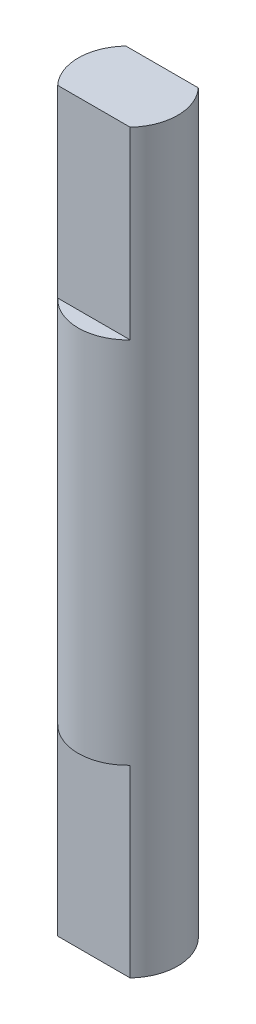
ISO-10303-21;
HEADER;
FILE_DESCRIPTION(('STEP AP214'),'2;1');
FILE_NAME('part.step','',(''),(''),'','','');
FILE_SCHEMA(('AUTOMOTIVE_DESIGN { 1 0 10303 214 1 1 1 1 }'));
ENDSEC;
DATA;
#1=APPLICATION_CONTEXT('core data for automotive mechanical design processes');
#2=APPLICATION_PROTOCOL_DEFINITION('international standard','automotive_design',2000,#1);
#3=PRODUCT_CONTEXT('',#1,'mechanical');
#4=PRODUCT('Part','Part','',(#3));
#5=PRODUCT_RELATED_PRODUCT_CATEGORY('part','',(#4));
#6=PRODUCT_DEFINITION_FORMATION('','',#4);
#7=PRODUCT_DEFINITION_CONTEXT('part definition',#1,'design');
#8=PRODUCT_DEFINITION('design','',#6,#7);
#9=PRODUCT_DEFINITION_SHAPE('','',#8);
#10=(LENGTH_UNIT() NAMED_UNIT(*) SI_UNIT(.MILLI.,.METRE.));
#11=(NAMED_UNIT(*) PLANE_ANGLE_UNIT() SI_UNIT($,.RADIAN.));
#12=(NAMED_UNIT(*) SI_UNIT($,.STERADIAN.) SOLID_ANGLE_UNIT());
#13=UNCERTAINTY_MEASURE_WITH_UNIT(LENGTH_MEASURE(1.E-05),#10,'distance_accuracy_value','');
#14=(GEOMETRIC_REPRESENTATION_CONTEXT(3) GLOBAL_UNCERTAINTY_ASSIGNED_CONTEXT((#13)) GLOBAL_UNIT_ASSIGNED_CONTEXT((#10,
#11,#12)) REPRESENTATION_CONTEXT('',''));
#15=CARTESIAN_POINT('',(0.,0.,0.));
#16=DIRECTION('',(0.,0.,1.));
#17=DIRECTION('',(1.,0.,0.));
#18=AXIS2_PLACEMENT_3D('',#15,#16,#17);
#19=CARTESIAN_POINT('',(0.,-10.,0.));
#20=DIRECTION('',(0.,1.,0.));
#21=DIRECTION('',(0.,0.,1.));
#22=AXIS2_PLACEMENT_3D('',#19,#20,#21);
#23=PLANE('',#22);
#24=CARTESIAN_POINT('',(0.,-10.,0.));
#25=DIRECTION('',(0.,1.,0.));
#26=DIRECTION('',(0.,0.,1.));
#27=AXIS2_PLACEMENT_3D('',#24,#25,#26);
#28=CIRCLE('',#27,2.7);
#29=CARTESIAN_POINT('',(1.96659604392971,-10.,-1.85));
#30=VERTEX_POINT('',#29);
#31=CARTESIAN_POINT('',(-1.96659604392971,-10.,-1.85));
#32=VERTEX_POINT('',#31);
#33=EDGE_CURVE('E153',#30,#32,#28,.T.);
#34=ORIENTED_EDGE('',*,*,#33,.F.);
#35=DIRECTION('',(-1.,0.,0.));
#36=VECTOR('',#35,1.);
#37=CARTESIAN_POINT('',(1.96659604392971,-10.,-1.85));
#38=LINE('',#37,#36);
#39=EDGE_CURVE('E113',#30,#32,#38,.T.);
#40=ORIENTED_EDGE('',*,*,#39,.T.);
#41=EDGE_LOOP('',(#34,#40));
#42=FACE_BOUND('',#41,.T.);
#43=ADVANCED_FACE('F32',(#42),#23,.F.);
#44=CARTESIAN_POINT('',(0.,10.,0.));
#45=DIRECTION('',(0.,1.,0.));
#46=DIRECTION('',(0.,0.,1.));
#47=AXIS2_PLACEMENT_3D('',#44,#45,#46);
#48=PLANE('',#47);
#49=DIRECTION('',(1.,0.,0.));
#50=VECTOR('',#49,1.);
#51=CARTESIAN_POINT('',(1.96659604392971,10.,1.85));
#52=LINE('',#51,#50);
#53=CARTESIAN_POINT('',(-1.96659604392971,10.,1.85));
#54=VERTEX_POINT('',#53);
#55=CARTESIAN_POINT('',(1.96659604392971,10.,1.85));
#56=VERTEX_POINT('',#55);
#57=EDGE_CURVE('E55',#54,#56,#52,.T.);
#58=ORIENTED_EDGE('',*,*,#57,.F.);
#59=CARTESIAN_POINT('',(0.,10.,0.));
#60=DIRECTION('',(0.,1.,0.));
#61=DIRECTION('',(0.,0.,1.));
#62=AXIS2_PLACEMENT_3D('',#59,#60,#61);
#63=CIRCLE('',#62,2.7);
#64=EDGE_CURVE('E41',#54,#56,#63,.T.);
#65=ORIENTED_EDGE('',*,*,#64,.T.);
#66=EDGE_LOOP('',(#58,#65));
#67=FACE_BOUND('',#66,.T.);
#68=ADVANCED_FACE('F170',(#67),#48,.T.);
#69=CARTESIAN_POINT('',(0.,10.,0.));
#70=DIRECTION('',(0.,-1.,0.));
#71=DIRECTION('',(0.,0.,-1.));
#72=AXIS2_PLACEMENT_3D('',#69,#70,#71);
#73=CYLINDRICAL_SURFACE('',#72,2.7);
#74=CARTESIAN_POINT('',(1.96659604392971,10.,-1.85));
#75=VERTEX_POINT('',#74);
#76=CARTESIAN_POINT('',(-1.96659604392971,10.,-1.85));
#77=VERTEX_POINT('',#76);
#78=EDGE_CURVE('E11',#75,#77,#63,.T.);
#79=ORIENTED_EDGE('',*,*,#78,.F.);
#80=DIRECTION('',(0.,-1.,0.));
#81=VECTOR('',#80,1.);
#82=CARTESIAN_POINT('',(1.96659604392971,20.,-1.85));
#83=LINE('',#82,#81);
#84=CARTESIAN_POINT('',(1.96659604392971,20.,-1.85));
#85=VERTEX_POINT('',#84);
#86=EDGE_CURVE('E151',#85,#75,#83,.T.);
#87=ORIENTED_EDGE('',*,*,#86,.F.);
#88=CARTESIAN_POINT('',(0.,20.,0.));
#89=DIRECTION('',(0.,1.,0.));
#90=DIRECTION('',(0.,0.,1.));
#91=AXIS2_PLACEMENT_3D('',#88,#89,#90);
#92=CIRCLE('',#91,2.7);
#93=CARTESIAN_POINT('',(1.96659604392971,20.,1.85));
#94=VERTEX_POINT('',#93);
#95=EDGE_CURVE('E130',#94,#85,#92,.T.);
#96=ORIENTED_EDGE('',*,*,#95,.F.);
#97=DIRECTION('',(0.,-1.,0.));
#98=VECTOR('',#97,1.);
#99=CARTESIAN_POINT('',(1.96659604392971,20.,1.85));
#100=LINE('',#99,#98);
#101=EDGE_CURVE('E139',#94,#56,#100,.T.);
#102=ORIENTED_EDGE('',*,*,#101,.T.);
#103=ORIENTED_EDGE('',*,*,#64,.F.);
#104=DIRECTION('',(0.,-1.,0.));
#105=VECTOR('',#104,1.);
#106=CARTESIAN_POINT('',(-1.96659604392971,20.,1.85));
#107=LINE('',#106,#105);
#108=CARTESIAN_POINT('',(-1.96659604392971,20.,1.85));
#109=VERTEX_POINT('',#108);
#110=EDGE_CURVE('E145',#109,#54,#107,.T.);
#111=ORIENTED_EDGE('',*,*,#110,.F.);
#112=CARTESIAN_POINT('',(0.,20.,0.));
#113=DIRECTION('',(0.,1.,0.));
#114=DIRECTION('',(0.,0.,1.));
#115=AXIS2_PLACEMENT_3D('',#112,#113,#114);
#116=CIRCLE('',#115,2.7);
#117=CARTESIAN_POINT('',(-1.96659604392971,20.,-1.85));
#118=VERTEX_POINT('',#117);
#119=EDGE_CURVE('E135',#118,#109,#116,.T.);
#120=ORIENTED_EDGE('',*,*,#119,.F.);
#121=DIRECTION('',(0.,-1.,0.));
#122=VECTOR('',#121,1.);
#123=CARTESIAN_POINT('',(-1.96659604392971,20.,-1.85));
#124=LINE('',#123,#122);
#125=EDGE_CURVE('E148',#118,#77,#124,.T.);
#126=ORIENTED_EDGE('',*,*,#125,.T.);
#127=EDGE_LOOP('',(#79,#87,#96,#102,#103,#111,#120,#126));
#128=FACE_BOUND('',#127,.T.);
#129=CARTESIAN_POINT('',(-1.96659604392971,-10.,1.85));
#130=VERTEX_POINT('',#129);
#131=CARTESIAN_POINT('',(1.96659604392971,-10.,1.85));
#132=VERTEX_POINT('',#131);
#133=EDGE_CURVE('E36',#130,#132,#28,.T.);
#134=ORIENTED_EDGE('',*,*,#133,.T.);
#135=DIRECTION('',(0.,1.,0.));
#136=VECTOR('',#135,1.);
#137=CARTESIAN_POINT('',(1.96659604392971,-20.,1.85));
#138=LINE('',#137,#136);
#139=CARTESIAN_POINT('',(1.96659604392971,-20.,1.85));
#140=VERTEX_POINT('',#139);
#141=EDGE_CURVE('E48',#140,#132,#138,.T.);
#142=ORIENTED_EDGE('',*,*,#141,.F.);
#143=CARTESIAN_POINT('',(0.,-20.,0.));
#144=DIRECTION('',(0.,1.,0.));
#145=DIRECTION('',(0.,0.,1.));
#146=AXIS2_PLACEMENT_3D('',#143,#144,#145);
#147=CIRCLE('',#146,2.7);
#148=CARTESIAN_POINT('',(1.96659604392971,-20.,-1.85));
#149=VERTEX_POINT('',#148);
#150=EDGE_CURVE('E99',#140,#149,#147,.T.);
#151=ORIENTED_EDGE('',*,*,#150,.T.);
#152=DIRECTION('',(0.,1.,0.));
#153=VECTOR('',#152,1.);
#154=CARTESIAN_POINT('',(1.96659604392971,-20.,-1.85));
#155=LINE('',#154,#153);
#156=EDGE_CURVE('E121',#149,#30,#155,.T.);
#157=ORIENTED_EDGE('',*,*,#156,.T.);
#158=ORIENTED_EDGE('',*,*,#33,.T.);
#159=DIRECTION('',(0.,1.,0.));
#160=VECTOR('',#159,1.);
#161=CARTESIAN_POINT('',(-1.96659604392971,-20.,-1.85));
#162=LINE('',#161,#160);
#163=CARTESIAN_POINT('',(-1.96659604392971,-20.,-1.85));
#164=VERTEX_POINT('',#163);
#165=EDGE_CURVE('E127',#164,#32,#162,.T.);
#166=ORIENTED_EDGE('',*,*,#165,.F.);
#167=CARTESIAN_POINT('',(0.,-20.,0.));
#168=DIRECTION('',(0.,1.,0.));
#169=DIRECTION('',(0.,0.,1.));
#170=AXIS2_PLACEMENT_3D('',#167,#168,#169);
#171=CIRCLE('',#170,2.7);
#172=CARTESIAN_POINT('',(-1.96659604392971,-20.,1.85));
#173=VERTEX_POINT('',#172);
#174=EDGE_CURVE('E116',#164,#173,#171,.T.);
#175=ORIENTED_EDGE('',*,*,#174,.T.);
#176=DIRECTION('',(0.,1.,0.));
#177=VECTOR('',#176,1.);
#178=CARTESIAN_POINT('',(-1.96659604392971,-20.,1.85));
#179=LINE('',#178,#177);
#180=EDGE_CURVE('E103',#173,#130,#179,.T.);
#181=ORIENTED_EDGE('',*,*,#180,.T.);
#182=EDGE_LOOP('',(#134,#142,#151,#157,#158,#166,#175,#181));
#183=FACE_BOUND('',#182,.T.);
#184=ADVANCED_FACE('F34',(#128,#183),#73,.T.);
#185=DIRECTION('',(-1.,0.,0.));
#186=VECTOR('',#185,1.);
#187=CARTESIAN_POINT('',(1.96659604392971,10.,-1.85));
#188=LINE('',#187,#186);
#189=EDGE_CURVE('E102',#75,#77,#188,.T.);
#190=ORIENTED_EDGE('',*,*,#189,.F.);
#191=ORIENTED_EDGE('',*,*,#78,.T.);
#192=EDGE_LOOP('',(#190,#191));
#193=FACE_BOUND('',#192,.T.);
#194=ADVANCED_FACE('F176',(#193),#48,.T.);
#195=ORIENTED_EDGE('',*,*,#133,.F.);
#196=DIRECTION('',(1.,0.,0.));
#197=VECTOR('',#196,1.);
#198=CARTESIAN_POINT('',(1.96659604392971,-10.,1.85));
#199=LINE('',#198,#197);
#200=EDGE_CURVE('E122',#130,#132,#199,.T.);
#201=ORIENTED_EDGE('',*,*,#200,.T.);
#202=EDGE_LOOP('',(#195,#201));
#203=FACE_BOUND('',#202,.T.);
#204=ADVANCED_FACE('F171',(#203),#23,.F.);
#205=CARTESIAN_POINT('',(1.96659604392971,20.,-1.85));
#206=DIRECTION('',(0.,0.,1.));
#207=DIRECTION('',(1.,0.,0.));
#208=AXIS2_PLACEMENT_3D('',#205,#206,#207);
#209=PLANE('',#208);
#210=ORIENTED_EDGE('',*,*,#189,.T.);
#211=ORIENTED_EDGE('',*,*,#125,.F.);
#212=DIRECTION('',(-1.,0.,0.));
#213=VECTOR('',#212,1.);
#214=CARTESIAN_POINT('',(1.96659604392971,20.,-1.85));
#215=LINE('',#214,#213);
#216=EDGE_CURVE('E133',#85,#118,#215,.T.);
#217=ORIENTED_EDGE('',*,*,#216,.F.);
#218=ORIENTED_EDGE('',*,*,#86,.T.);
#219=EDGE_LOOP('',(#210,#211,#217,#218));
#220=FACE_BOUND('',#219,.T.);
#221=ADVANCED_FACE('F178',(#220),#209,.F.);
#222=CARTESIAN_POINT('',(1.96659604392971,20.,1.85));
#223=DIRECTION('',(0.,0.,-1.));
#224=DIRECTION('',(-1.,0.,0.));
#225=AXIS2_PLACEMENT_3D('',#222,#223,#224);
#226=PLANE('',#225);
#227=ORIENTED_EDGE('',*,*,#57,.T.);
#228=ORIENTED_EDGE('',*,*,#101,.F.);
#229=DIRECTION('',(1.,0.,0.));
#230=VECTOR('',#229,1.);
#231=CARTESIAN_POINT('',(1.96659604392971,20.,1.85));
#232=LINE('',#231,#230);
#233=EDGE_CURVE('E137',#109,#94,#232,.T.);
#234=ORIENTED_EDGE('',*,*,#233,.F.);
#235=ORIENTED_EDGE('',*,*,#110,.T.);
#236=EDGE_LOOP('',(#227,#228,#234,#235));
#237=FACE_BOUND('',#236,.T.);
#238=ADVANCED_FACE('F184',(#237),#226,.F.);
#239=CARTESIAN_POINT('',(0.,20.,0.));
#240=DIRECTION('',(0.,1.,0.));
#241=DIRECTION('',(0.,0.,1.));
#242=AXIS2_PLACEMENT_3D('',#239,#240,#241);
#243=PLANE('',#242);
#244=ORIENTED_EDGE('',*,*,#95,.T.);
#245=ORIENTED_EDGE('',*,*,#216,.T.);
#246=ORIENTED_EDGE('',*,*,#119,.T.);
#247=ORIENTED_EDGE('',*,*,#233,.T.);
#248=EDGE_LOOP('',(#244,#245,#246,#247));
#249=FACE_BOUND('',#248,.T.);
#250=ADVANCED_FACE('F167',(#249),#243,.T.);
#251=CARTESIAN_POINT('',(1.96659604392971,-20.,1.85));
#252=DIRECTION('',(0.,0.,1.));
#253=DIRECTION('',(1.,0.,0.));
#254=AXIS2_PLACEMENT_3D('',#251,#252,#253);
#255=PLANE('',#254);
#256=ORIENTED_EDGE('',*,*,#200,.F.);
#257=ORIENTED_EDGE('',*,*,#180,.F.);
#258=DIRECTION('',(1.,0.,0.));
#259=VECTOR('',#258,1.);
#260=CARTESIAN_POINT('',(1.96659604392971,-20.,1.85));
#261=LINE('',#260,#259);
#262=EDGE_CURVE('E109',#173,#140,#261,.T.);
#263=ORIENTED_EDGE('',*,*,#262,.T.);
#264=ORIENTED_EDGE('',*,*,#141,.T.);
#265=EDGE_LOOP('',(#256,#257,#263,#264));
#266=FACE_BOUND('',#265,.T.);
#267=ADVANCED_FACE('F115',(#266),#255,.T.);
#268=CARTESIAN_POINT('',(1.96659604392971,-20.,-1.85));
#269=DIRECTION('',(0.,0.,-1.));
#270=DIRECTION('',(-1.,0.,0.));
#271=AXIS2_PLACEMENT_3D('',#268,#269,#270);
#272=PLANE('',#271);
#273=ORIENTED_EDGE('',*,*,#39,.F.);
#274=ORIENTED_EDGE('',*,*,#156,.F.);
#275=DIRECTION('',(-1.,0.,0.));
#276=VECTOR('',#275,1.);
#277=CARTESIAN_POINT('',(1.96659604392971,-20.,-1.85));
#278=LINE('',#277,#276);
#279=EDGE_CURVE('E112',#149,#164,#278,.T.);
#280=ORIENTED_EDGE('',*,*,#279,.T.);
#281=ORIENTED_EDGE('',*,*,#165,.T.);
#282=EDGE_LOOP('',(#273,#274,#280,#281));
#283=FACE_BOUND('',#282,.T.);
#284=ADVANCED_FACE('F159',(#283),#272,.T.);
#285=CARTESIAN_POINT('',(0.,-20.,0.));
#286=DIRECTION('',(0.,-1.,0.));
#287=DIRECTION('',(0.,0.,1.));
#288=AXIS2_PLACEMENT_3D('',#285,#286,#287);
#289=PLANE('',#288);
#290=ORIENTED_EDGE('',*,*,#150,.F.);
#291=ORIENTED_EDGE('',*,*,#262,.F.);
#292=ORIENTED_EDGE('',*,*,#174,.F.);
#293=ORIENTED_EDGE('',*,*,#279,.F.);
#294=EDGE_LOOP('',(#290,#291,#292,#293));
#295=FACE_BOUND('',#294,.T.);
#296=ADVANCED_FACE('F107',(#295),#289,.T.);
#297=CLOSED_SHELL('',(#43,#68,#184,#194,#204,#221,#238,#250,#267,#284,#296));
#298=MANIFOLD_SOLID_BREP('B2',#297);
#299=ADVANCED_BREP_SHAPE_REPRESENTATION('',(#18,#298),#14);
#300=SHAPE_DEFINITION_REPRESENTATION(#9,#299);
ENDSEC;
END-ISO-10303-21;
